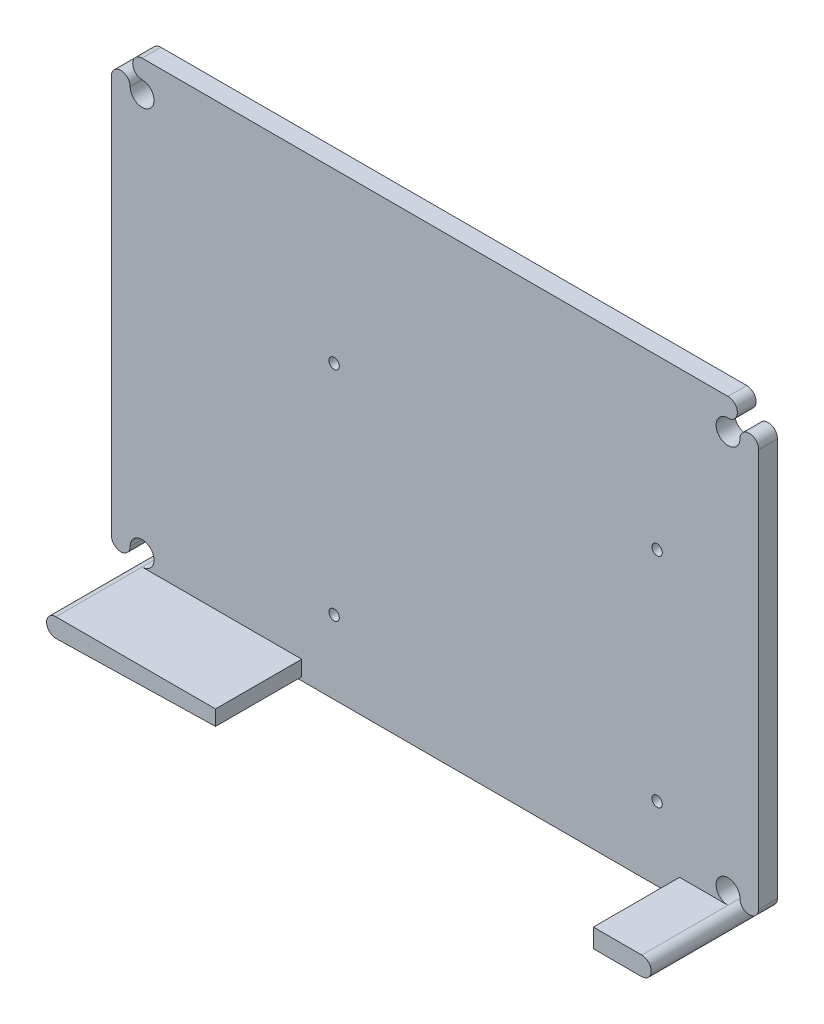
ISO-10303-21;
HEADER;
FILE_DESCRIPTION(('STEP AP214'),'2;1');
FILE_NAME('part.step','',(''),(''),'','','');
FILE_SCHEMA(('AUTOMOTIVE_DESIGN { 1 0 10303 214 1 1 1 1 }'));
ENDSEC;
DATA;
#1=APPLICATION_CONTEXT('core data for automotive mechanical design processes');
#2=APPLICATION_PROTOCOL_DEFINITION('international standard','automotive_design',2000,#1);
#3=PRODUCT_CONTEXT('',#1,'mechanical');
#4=PRODUCT('Part','Part','',(#3));
#5=PRODUCT_RELATED_PRODUCT_CATEGORY('part','',(#4));
#6=PRODUCT_DEFINITION_FORMATION('','',#4);
#7=PRODUCT_DEFINITION_CONTEXT('part definition',#1,'design');
#8=PRODUCT_DEFINITION('design','',#6,#7);
#9=PRODUCT_DEFINITION_SHAPE('','',#8);
#10=(LENGTH_UNIT() NAMED_UNIT(*) SI_UNIT(.MILLI.,.METRE.));
#11=(NAMED_UNIT(*) PLANE_ANGLE_UNIT() SI_UNIT($,.RADIAN.));
#12=(NAMED_UNIT(*) SI_UNIT($,.STERADIAN.) SOLID_ANGLE_UNIT());
#13=UNCERTAINTY_MEASURE_WITH_UNIT(LENGTH_MEASURE(1.E-05),#10,'distance_accuracy_value','');
#14=(GEOMETRIC_REPRESENTATION_CONTEXT(3) GLOBAL_UNCERTAINTY_ASSIGNED_CONTEXT((#13)) GLOBAL_UNIT_ASSIGNED_CONTEXT((#10,
#11,#12)) REPRESENTATION_CONTEXT('',''));
#15=CARTESIAN_POINT('',(0.,0.,0.));
#16=DIRECTION('',(0.,0.,1.));
#17=DIRECTION('',(1.,0.,0.));
#18=AXIS2_PLACEMENT_3D('',#15,#16,#17);
#19=CARTESIAN_POINT('',(77.993863436123,58.6749966821654,5.));
#20=DIRECTION('',(0.,0.,1.));
#21=DIRECTION('',(1.,0.,0.));
#22=AXIS2_PLACEMENT_3D('',#19,#20,#21);
#23=PLANE('',#22);
#24=CARTESIAN_POINT('',(59.1253494650505,16.3622236942246,5.));
#25=DIRECTION('',(0.,0.,1.));
#26=DIRECTION('',(1.,0.,0.));
#27=AXIS2_PLACEMENT_3D('',#24,#25,#26);
#28=CIRCLE('',#27,1.38);
#29=CARTESIAN_POINT('',(60.5053494650505,16.3622236942246,5.));
#30=VERTEX_POINT('',#29);
#31=EDGE_CURVE('E450',#30,#30,#28,.T.);
#32=ORIENTED_EDGE('',*,*,#31,.F.);
#33=EDGE_LOOP('',(#32));
#34=FACE_BOUND('',#33,.T.);
#35=CARTESIAN_POINT('',(-26.8746505349495,-41.6377763057754,5.));
#36=DIRECTION('',(0.,0.,1.));
#37=DIRECTION('',(1.,0.,0.));
#38=AXIS2_PLACEMENT_3D('',#35,#36,#37);
#39=CIRCLE('',#38,1.38);
#40=CARTESIAN_POINT('',(-25.4946505349495,-41.6377763057754,5.));
#41=VERTEX_POINT('',#40);
#42=EDGE_CURVE('E441',#41,#41,#39,.T.);
#43=ORIENTED_EDGE('',*,*,#42,.F.);
#44=EDGE_LOOP('',(#43));
#45=FACE_BOUND('',#44,.T.);
#46=CARTESIAN_POINT('',(-26.8746505349495,16.3622236942246,5.));
#47=DIRECTION('',(0.,0.,1.));
#48=DIRECTION('',(1.,0.,0.));
#49=AXIS2_PLACEMENT_3D('',#46,#47,#48);
#50=CIRCLE('',#49,1.38);
#51=CARTESIAN_POINT('',(-25.4946505349495,16.3622236942246,5.));
#52=VERTEX_POINT('',#51);
#53=EDGE_CURVE('E457',#52,#52,#50,.T.);
#54=ORIENTED_EDGE('',*,*,#53,.F.);
#55=EDGE_LOOP('',(#54));
#56=FACE_BOUND('',#55,.T.);
#57=CARTESIAN_POINT('',(59.1253494650505,-41.6377763057754,5.));
#58=DIRECTION('',(0.,0.,1.));
#59=DIRECTION('',(1.,0.,0.));
#60=AXIS2_PLACEMENT_3D('',#57,#58,#59);
#61=CIRCLE('',#60,1.38000000000001);
#62=CARTESIAN_POINT('',(60.5053494650505,-41.6377763057754,5.));
#63=VERTEX_POINT('',#62);
#64=EDGE_CURVE('E433',#63,#63,#61,.T.);
#65=ORIENTED_EDGE('',*,*,#64,.F.);
#66=EDGE_LOOP('',(#65));
#67=FACE_BOUND('',#66,.T.);
#68=DIRECTION('',(1.,0.,0.));
#69=VECTOR('',#68,1.);
#70=CARTESIAN_POINT('',(-77.9999999999997,-61.1750000000004,5.));
#71=LINE('',#70,#69);
#72=CARTESIAN_POINT('',(-77.9999999999997,-61.1750000000004,5.));
#73=VERTEX_POINT('',#72);
#74=CARTESIAN_POINT('',(65.0992655319275,-61.1750000000004,5.));
#75=VERTEX_POINT('',#74);
#76=EDGE_CURVE('E330',#73,#75,#71,.T.);
#77=ORIENTED_EDGE('',*,*,#76,.T.);
#78=DIRECTION('',(0.,-1.,0.));
#79=VECTOR('',#78,1.);
#80=CARTESIAN_POINT('',(65.0992655319275,-56.1750000000004,5.));
#81=LINE('',#80,#79);
#82=CARTESIAN_POINT('',(65.0992655319275,-56.1750000000004,5.));
#83=VERTEX_POINT('',#82);
#84=EDGE_CURVE('E414',#83,#75,#81,.T.);
#85=ORIENTED_EDGE('',*,*,#84,.F.);
#86=DIRECTION('',(-1.,0.,0.));
#87=VECTOR('',#86,1.);
#88=CARTESIAN_POINT('',(78.0000000000003,-56.1750000000004,5.));
#89=LINE('',#88,#87);
#90=CARTESIAN_POINT('',(78.0000000000003,-56.1750000000004,5.));
#91=VERTEX_POINT('',#90);
#92=EDGE_CURVE('E341',#91,#83,#89,.T.);
#93=ORIENTED_EDGE('',*,*,#92,.F.);
#94=CARTESIAN_POINT('',(78.0000000000003,-53.0000000000003,5.));
#95=DIRECTION('',(0.,0.,-1.));
#96=DIRECTION('',(1.,0.,0.));
#97=AXIS2_PLACEMENT_3D('',#94,#95,#96);
#98=CIRCLE('',#97,3.17500000000003);
#99=CARTESIAN_POINT('',(81.1750000000003,-53.0000000000004,5.));
#100=VERTEX_POINT('',#99);
#101=EDGE_CURVE('E333',#91,#100,#98,.T.);
#102=ORIENTED_EDGE('',*,*,#101,.T.);
#103=CARTESIAN_POINT('',(83.6750000000003,-53.0000000000005,5.));
#104=DIRECTION('',(0.,0.,1.));
#105=DIRECTION('',(-1.,0.,0.));
#106=AXIS2_PLACEMENT_3D('',#103,#104,#105);
#107=CIRCLE('',#106,2.49999999999975);
#108=CARTESIAN_POINT('',(86.175,-53.0000000000006,5.));
#109=VERTEX_POINT('',#108);
#110=EDGE_CURVE('E171',#100,#109,#107,.T.);
#111=ORIENTED_EDGE('',*,*,#110,.T.);
#112=DIRECTION('',(0.,1.,0.));
#113=VECTOR('',#112,1.);
#114=CARTESIAN_POINT('',(86.1749999999998,-53.0000000000006,5.));
#115=LINE('',#114,#113);
#116=CARTESIAN_POINT('',(86.1749999999997,53.0000000000004,5.));
#117=VERTEX_POINT('',#116);
#118=EDGE_CURVE('E164',#109,#117,#115,.T.);
#119=ORIENTED_EDGE('',*,*,#118,.T.);
#120=CARTESIAN_POINT('',(83.6749999999997,53.0000000000004,5.));
#121=DIRECTION('',(0.,0.,1.));
#122=DIRECTION('',(-1.,0.,0.));
#123=AXIS2_PLACEMENT_3D('',#120,#121,#122);
#124=CIRCLE('',#123,2.49999999999999);
#125=CARTESIAN_POINT('',(81.1749999999997,53.0000000000004,5.));
#126=VERTEX_POINT('',#125);
#127=EDGE_CURVE('E168',#117,#126,#124,.T.);
#128=ORIENTED_EDGE('',*,*,#127,.T.);
#129=CARTESIAN_POINT('',(77.9999999999997,53.0000000000004,5.));
#130=DIRECTION('',(0.,0.,-1.));
#131=DIRECTION('',(1.,0.,0.));
#132=AXIS2_PLACEMENT_3D('',#129,#130,#131);
#133=CIRCLE('',#132,3.17500000000001);
#134=CARTESIAN_POINT('',(77.9965667682273,56.1749981437667,5.));
#135=VERTEX_POINT('',#134);
#136=EDGE_CURVE('E63',#126,#135,#133,.T.);
#137=ORIENTED_EDGE('',*,*,#136,.T.);
#138=CARTESIAN_POINT('',(77.993863436123,58.6749966821654,5.));
#139=DIRECTION('',(0.,0.,1.));
#140=DIRECTION('',(1.,0.,0.));
#141=AXIS2_PLACEMENT_3D('',#138,#139,#140);
#142=CIRCLE('',#141,2.50000000000001);
#143=CARTESIAN_POINT('',(77.9911601040188,61.1749952205641,5.));
#144=VERTEX_POINT('',#143);
#145=EDGE_CURVE('E244',#135,#144,#142,.T.);
#146=ORIENTED_EDGE('',*,*,#145,.T.);
#147=DIRECTION('',(-1.,0.,0.));
#148=VECTOR('',#147,1.);
#149=CARTESIAN_POINT('',(-77.9999999999997,61.1749952205641,5.));
#150=LINE('',#149,#148);
#151=CARTESIAN_POINT('',(-77.9999999999997,61.1749952205641,5.));
#152=VERTEX_POINT('',#151);
#153=EDGE_CURVE('E128',#144,#152,#150,.T.);
#154=ORIENTED_EDGE('',*,*,#153,.T.);
#155=CARTESIAN_POINT('',(-77.9999999999997,58.6749952205641,5.));
#156=DIRECTION('',(0.,0.,1.));
#157=DIRECTION('',(-1.,0.,0.));
#158=AXIS2_PLACEMENT_3D('',#155,#156,#157);
#159=CIRCLE('',#158,2.49999999999999);
#160=CARTESIAN_POINT('',(-77.9999999999997,56.1749952205641,5.));
#161=VERTEX_POINT('',#160);
#162=EDGE_CURVE('E297',#152,#161,#159,.T.);
#163=ORIENTED_EDGE('',*,*,#162,.T.);
#164=CARTESIAN_POINT('',(-77.9999999999997,52.9999952205641,5.));
#165=DIRECTION('',(0.,0.,-1.));
#166=DIRECTION('',(1.,0.,0.));
#167=AXIS2_PLACEMENT_3D('',#164,#165,#166);
#168=CIRCLE('',#167,3.17500000000001);
#169=CARTESIAN_POINT('',(-81.1749999999997,52.9999952205641,5.));
#170=VERTEX_POINT('',#169);
#171=EDGE_CURVE('E316',#161,#170,#168,.T.);
#172=ORIENTED_EDGE('',*,*,#171,.T.);
#173=CARTESIAN_POINT('',(-83.6749999999997,52.9999952205641,5.));
#174=DIRECTION('',(0.,0.,1.));
#175=DIRECTION('',(-1.,0.,0.));
#176=AXIS2_PLACEMENT_3D('',#173,#174,#175);
#177=CIRCLE('',#176,2.49999999999999);
#178=CARTESIAN_POINT('',(-86.1749999999997,52.9999952205641,5.));
#179=VERTEX_POINT('',#178);
#180=EDGE_CURVE('E312',#170,#179,#177,.T.);
#181=ORIENTED_EDGE('',*,*,#180,.T.);
#182=DIRECTION('',(0.,-1.,0.));
#183=VECTOR('',#182,1.);
#184=CARTESIAN_POINT('',(-86.1749999999997,-53.0000000000004,5.));
#185=LINE('',#184,#183);
#186=CARTESIAN_POINT('',(-86.1749999999997,-53.0000000000004,5.));
#187=VERTEX_POINT('',#186);
#188=EDGE_CURVE('E315',#179,#187,#185,.T.);
#189=ORIENTED_EDGE('',*,*,#188,.T.);
#190=CARTESIAN_POINT('',(-83.6749999999997,-53.0000000000004,5.));
#191=DIRECTION('',(0.,0.,1.));
#192=DIRECTION('',(-1.,0.,0.));
#193=AXIS2_PLACEMENT_3D('',#190,#191,#192);
#194=CIRCLE('',#193,2.50000000000002);
#195=CARTESIAN_POINT('',(-81.1749999999997,-53.0000000000004,5.));
#196=VERTEX_POINT('',#195);
#197=EDGE_CURVE('E320',#187,#196,#194,.T.);
#198=ORIENTED_EDGE('',*,*,#197,.T.);
#199=CARTESIAN_POINT('',(-77.9999999999997,-53.0000000000004,5.));
#200=DIRECTION('',(0.,0.,-1.));
#201=DIRECTION('',(1.,0.,0.));
#202=AXIS2_PLACEMENT_3D('',#199,#200,#201);
#203=CIRCLE('',#202,3.175);
#204=CARTESIAN_POINT('',(-77.9999999999997,-56.1750000000004,5.));
#205=VERTEX_POINT('',#204);
#206=EDGE_CURVE('E327',#196,#205,#203,.T.);
#207=ORIENTED_EDGE('',*,*,#206,.T.);
#208=DIRECTION('',(-1.,0.,0.));
#209=VECTOR('',#208,1.);
#210=CARTESIAN_POINT('',(-77.9999999999997,-56.1750000000004,5.));
#211=LINE('',#210,#209);
#212=CARTESIAN_POINT('',(-35.4999999999997,-56.1750000000004,5.));
#213=VERTEX_POINT('',#212);
#214=EDGE_CURVE('E55',#213,#205,#211,.T.);
#215=ORIENTED_EDGE('',*,*,#214,.F.);
#216=DIRECTION('',(0.,1.,0.));
#217=VECTOR('',#216,1.);
#218=CARTESIAN_POINT('',(-35.4999999999997,-56.1750000000004,5.));
#219=LINE('',#218,#217);
#220=CARTESIAN_POINT('',(-35.4999999999997,-60.2122236942248,5.));
#221=VERTEX_POINT('',#220);
#222=EDGE_CURVE('E378',#221,#213,#219,.T.);
#223=ORIENTED_EDGE('',*,*,#222,.F.);
#224=DIRECTION('',(0.999743506823469,0.0226477496522961,0.));
#225=VECTOR('',#224,1.);
#226=CARTESIAN_POINT('',(-35.4999999999997,-60.2122236942248,5.));
#227=LINE('',#226,#225);
#228=EDGE_CURVE('E381',#73,#221,#227,.T.);
#229=ORIENTED_EDGE('',*,*,#228,.F.);
#230=EDGE_LOOP('',(#77,#85,#93,#102,#111,#119,#128,#137,#146,#154,#163,#172,#181,#189,#198,#207,
#215,#223,#229));
#231=FACE_BOUND('',#230,.T.);
#232=ADVANCED_FACE('F39',(#34,#45,#56,#67,#231),#23,.T.);
#233=CARTESIAN_POINT('',(77.993863436123,58.6749966821654,5.));
#234=DIRECTION('',(0.,0.,-1.));
#235=DIRECTION('',(-1.,0.,0.));
#236=AXIS2_PLACEMENT_3D('',#233,#234,#235);
#237=CYLINDRICAL_SURFACE('',#236,2.50000000000001);
#238=CARTESIAN_POINT('',(77.993863436123,58.6749966821654,0.));
#239=DIRECTION('',(0.,0.,1.));
#240=DIRECTION('',(1.,0.,0.));
#241=AXIS2_PLACEMENT_3D('',#238,#239,#240);
#242=CIRCLE('',#241,2.50000000000001);
#243=CARTESIAN_POINT('',(77.9965667682273,56.1749981437667,0.));
#244=VERTEX_POINT('',#243);
#245=CARTESIAN_POINT('',(77.9911601040188,61.1749952205641,0.));
#246=VERTEX_POINT('',#245);
#247=EDGE_CURVE('E196',#244,#246,#242,.T.);
#248=ORIENTED_EDGE('',*,*,#247,.T.);
#249=DIRECTION('',(0.,0.,-1.));
#250=VECTOR('',#249,1.);
#251=CARTESIAN_POINT('',(77.9911601040188,61.1749952205641,5.));
#252=LINE('',#251,#250);
#253=EDGE_CURVE('E11',#144,#246,#252,.T.);
#254=ORIENTED_EDGE('',*,*,#253,.F.);
#255=ORIENTED_EDGE('',*,*,#145,.F.);
#256=DIRECTION('',(0.,0.,-1.));
#257=VECTOR('',#256,1.);
#258=CARTESIAN_POINT('',(77.9965667682273,56.1749981437667,5.));
#259=LINE('',#258,#257);
#260=EDGE_CURVE('E192',#135,#244,#259,.T.);
#261=ORIENTED_EDGE('',*,*,#260,.T.);
#262=EDGE_LOOP('',(#248,#254,#255,#261));
#263=FACE_BOUND('',#262,.T.);
#264=ADVANCED_FACE('F41',(#263),#237,.T.);
#265=CARTESIAN_POINT('',(-77.9999999999997,61.1749952205641,5.));
#266=DIRECTION('',(0.,-1.,0.));
#267=DIRECTION('',(0.,0.,-1.));
#268=AXIS2_PLACEMENT_3D('',#265,#266,#267);
#269=PLANE('',#268);
#270=DIRECTION('',(-1.,0.,0.));
#271=VECTOR('',#270,1.);
#272=CARTESIAN_POINT('',(-77.9999999999997,61.1749952205641,0.));
#273=LINE('',#272,#271);
#274=CARTESIAN_POINT('',(-77.9999999999997,61.1749952205641,0.));
#275=VERTEX_POINT('',#274);
#276=EDGE_CURVE('E200',#246,#275,#273,.T.);
#277=ORIENTED_EDGE('',*,*,#276,.T.);
#278=DIRECTION('',(0.,0.,-1.));
#279=VECTOR('',#278,1.);
#280=CARTESIAN_POINT('',(-77.9999999999997,61.1749952205641,5.));
#281=LINE('',#280,#279);
#282=EDGE_CURVE('E48',#152,#275,#281,.T.);
#283=ORIENTED_EDGE('',*,*,#282,.F.);
#284=ORIENTED_EDGE('',*,*,#153,.F.);
#285=ORIENTED_EDGE('',*,*,#253,.T.);
#286=EDGE_LOOP('',(#277,#283,#284,#285));
#287=FACE_BOUND('',#286,.T.);
#288=ADVANCED_FACE('F560',(#287),#269,.F.);
#289=CARTESIAN_POINT('',(-77.9999999999997,58.6749952205641,5.));
#290=DIRECTION('',(0.,0.,-1.));
#291=DIRECTION('',(-1.,0.,0.));
#292=AXIS2_PLACEMENT_3D('',#289,#290,#291);
#293=CYLINDRICAL_SURFACE('',#292,2.49999999999999);
#294=CARTESIAN_POINT('',(-77.9999999999997,58.6749952205641,0.));
#295=DIRECTION('',(0.,0.,1.));
#296=DIRECTION('',(-1.,0.,0.));
#297=AXIS2_PLACEMENT_3D('',#294,#295,#296);
#298=CIRCLE('',#297,2.49999999999999);
#299=CARTESIAN_POINT('',(-77.9999999999997,56.1749952205641,0.));
#300=VERTEX_POINT('',#299);
#301=EDGE_CURVE('E204',#275,#300,#298,.T.);
#302=ORIENTED_EDGE('',*,*,#301,.T.);
#303=DIRECTION('',(0.,0.,-1.));
#304=VECTOR('',#303,1.);
#305=CARTESIAN_POINT('',(-77.9999999999997,56.1749952205641,5.));
#306=LINE('',#305,#304);
#307=EDGE_CURVE('E287',#161,#300,#306,.T.);
#308=ORIENTED_EDGE('',*,*,#307,.F.);
#309=ORIENTED_EDGE('',*,*,#162,.F.);
#310=ORIENTED_EDGE('',*,*,#282,.T.);
#311=EDGE_LOOP('',(#302,#308,#309,#310));
#312=FACE_BOUND('',#311,.T.);
#313=ADVANCED_FACE('F295',(#312),#293,.T.);
#314=CARTESIAN_POINT('',(-77.9999999999997,52.9999952205641,5.));
#315=DIRECTION('',(0.,0.,-1.));
#316=DIRECTION('',(-1.,0.,0.));
#317=AXIS2_PLACEMENT_3D('',#314,#315,#316);
#318=CYLINDRICAL_SURFACE('',#317,3.17500000000001);
#319=CARTESIAN_POINT('',(-77.9999999999997,52.9999952205641,0.));
#320=DIRECTION('',(0.,0.,-1.));
#321=DIRECTION('',(1.,0.,0.));
#322=AXIS2_PLACEMENT_3D('',#319,#320,#321);
#323=CIRCLE('',#322,3.17500000000001);
#324=CARTESIAN_POINT('',(-81.1749999999997,52.9999952205641,0.));
#325=VERTEX_POINT('',#324);
#326=EDGE_CURVE('E207',#300,#325,#323,.T.);
#327=ORIENTED_EDGE('',*,*,#326,.T.);
#328=DIRECTION('',(0.,0.,-1.));
#329=VECTOR('',#328,1.);
#330=CARTESIAN_POINT('',(-81.1749999999997,52.9999952205641,5.));
#331=LINE('',#330,#329);
#332=EDGE_CURVE('E283',#170,#325,#331,.T.);
#333=ORIENTED_EDGE('',*,*,#332,.F.);
#334=ORIENTED_EDGE('',*,*,#171,.F.);
#335=ORIENTED_EDGE('',*,*,#307,.T.);
#336=EDGE_LOOP('',(#327,#333,#334,#335));
#337=FACE_BOUND('',#336,.T.);
#338=ADVANCED_FACE('F306',(#337),#318,.F.);
#339=CARTESIAN_POINT('',(-83.6749999999997,52.9999952205641,5.));
#340=DIRECTION('',(0.,0.,-1.));
#341=DIRECTION('',(-1.,0.,0.));
#342=AXIS2_PLACEMENT_3D('',#339,#340,#341);
#343=CYLINDRICAL_SURFACE('',#342,2.49999999999999);
#344=CARTESIAN_POINT('',(-83.6749999999997,52.9999952205641,0.));
#345=DIRECTION('',(0.,0.,1.));
#346=DIRECTION('',(-1.,0.,0.));
#347=AXIS2_PLACEMENT_3D('',#344,#345,#346);
#348=CIRCLE('',#347,2.49999999999999);
#349=CARTESIAN_POINT('',(-86.1749999999997,52.9999952205641,0.));
#350=VERTEX_POINT('',#349);
#351=EDGE_CURVE('E210',#325,#350,#348,.T.);
#352=ORIENTED_EDGE('',*,*,#351,.T.);
#353=DIRECTION('',(0.,0.,-1.));
#354=VECTOR('',#353,1.);
#355=CARTESIAN_POINT('',(-86.1749999999997,52.9999952205641,5.));
#356=LINE('',#355,#354);
#357=EDGE_CURVE('E279',#179,#350,#356,.T.);
#358=ORIENTED_EDGE('',*,*,#357,.F.);
#359=ORIENTED_EDGE('',*,*,#180,.F.);
#360=ORIENTED_EDGE('',*,*,#332,.T.);
#361=EDGE_LOOP('',(#352,#358,#359,#360));
#362=FACE_BOUND('',#361,.T.);
#363=ADVANCED_FACE('F310',(#362),#343,.T.);
#364=CARTESIAN_POINT('',(-86.1749999999997,-53.0000000000004,5.));
#365=DIRECTION('',(1.,0.,0.));
#366=DIRECTION('',(0.,1.,0.));
#367=AXIS2_PLACEMENT_3D('',#364,#365,#366);
#368=PLANE('',#367);
#369=DIRECTION('',(0.,-1.,0.));
#370=VECTOR('',#369,1.);
#371=CARTESIAN_POINT('',(-86.1749999999997,-53.0000000000004,0.));
#372=LINE('',#371,#370);
#373=CARTESIAN_POINT('',(-86.1749999999997,-53.0000000000004,0.));
#374=VERTEX_POINT('',#373);
#375=EDGE_CURVE('E213',#350,#374,#372,.T.);
#376=ORIENTED_EDGE('',*,*,#375,.T.);
#377=DIRECTION('',(0.,0.,-1.));
#378=VECTOR('',#377,1.);
#379=CARTESIAN_POINT('',(-86.1749999999997,-53.0000000000004,5.));
#380=LINE('',#379,#378);
#381=EDGE_CURVE('E275',#187,#374,#380,.T.);
#382=ORIENTED_EDGE('',*,*,#381,.F.);
#383=ORIENTED_EDGE('',*,*,#188,.F.);
#384=ORIENTED_EDGE('',*,*,#357,.T.);
#385=EDGE_LOOP('',(#376,#382,#383,#384));
#386=FACE_BOUND('',#385,.T.);
#387=ADVANCED_FACE('F550',(#386),#368,.F.);
#388=CARTESIAN_POINT('',(-83.6749999999997,-53.0000000000004,5.));
#389=DIRECTION('',(0.,0.,-1.));
#390=DIRECTION('',(-1.,0.,0.));
#391=AXIS2_PLACEMENT_3D('',#388,#389,#390);
#392=CYLINDRICAL_SURFACE('',#391,2.50000000000002);
#393=CARTESIAN_POINT('',(-83.6749999999997,-53.0000000000004,0.));
#394=DIRECTION('',(0.,0.,1.));
#395=DIRECTION('',(-1.,0.,0.));
#396=AXIS2_PLACEMENT_3D('',#393,#394,#395);
#397=CIRCLE('',#396,2.50000000000002);
#398=CARTESIAN_POINT('',(-81.1749999999997,-53.0000000000004,0.));
#399=VERTEX_POINT('',#398);
#400=EDGE_CURVE('E216',#374,#399,#397,.T.);
#401=ORIENTED_EDGE('',*,*,#400,.T.);
#402=DIRECTION('',(0.,0.,-1.));
#403=VECTOR('',#402,1.);
#404=CARTESIAN_POINT('',(-81.1749999999997,-53.0000000000004,5.));
#405=LINE('',#404,#403);
#406=EDGE_CURVE('E271',#196,#399,#405,.T.);
#407=ORIENTED_EDGE('',*,*,#406,.F.);
#408=ORIENTED_EDGE('',*,*,#197,.F.);
#409=ORIENTED_EDGE('',*,*,#381,.T.);
#410=EDGE_LOOP('',(#401,#407,#408,#409));
#411=FACE_BOUND('',#410,.T.);
#412=ADVANCED_FACE('F546',(#411),#392,.T.);
#413=CARTESIAN_POINT('',(-77.9999999999997,-53.0000000000004,5.));
#414=DIRECTION('',(0.,0.,-1.));
#415=DIRECTION('',(-1.,0.,0.));
#416=AXIS2_PLACEMENT_3D('',#413,#414,#415);
#417=CYLINDRICAL_SURFACE('',#416,3.175);
#418=CARTESIAN_POINT('',(-77.9999999999997,-53.0000000000004,0.));
#419=DIRECTION('',(0.,0.,-1.));
#420=DIRECTION('',(1.,0.,0.));
#421=AXIS2_PLACEMENT_3D('',#418,#419,#420);
#422=CIRCLE('',#421,3.175);
#423=CARTESIAN_POINT('',(-77.9999999999997,-56.1750000000004,0.));
#424=VERTEX_POINT('',#423);
#425=EDGE_CURVE('E219',#399,#424,#422,.T.);
#426=ORIENTED_EDGE('',*,*,#425,.T.);
#427=DIRECTION('',(0.,0.,-1.));
#428=VECTOR('',#427,1.);
#429=CARTESIAN_POINT('',(-77.9999999999997,-56.1750000000004,5.));
#430=LINE('',#429,#428);
#431=EDGE_CURVE('E267',#205,#424,#430,.T.);
#432=ORIENTED_EDGE('',*,*,#431,.F.);
#433=ORIENTED_EDGE('',*,*,#206,.F.);
#434=ORIENTED_EDGE('',*,*,#406,.T.);
#435=EDGE_LOOP('',(#426,#432,#433,#434));
#436=FACE_BOUND('',#435,.T.);
#437=ADVANCED_FACE('F542',(#436),#417,.F.);
#438=CARTESIAN_POINT('',(-77.9999999999997,-58.6750000000004,5.));
#439=DIRECTION('',(0.,0.,-1.));
#440=DIRECTION('',(-1.,0.,0.));
#441=AXIS2_PLACEMENT_3D('',#438,#439,#440);
#442=CYLINDRICAL_SURFACE('',#441,2.49999999999999);
#443=CARTESIAN_POINT('',(-77.9999999999997,-58.6750000000004,0.));
#444=DIRECTION('',(0.,0.,1.));
#445=DIRECTION('',(1.,0.,0.));
#446=AXIS2_PLACEMENT_3D('',#443,#444,#445);
#447=CIRCLE('',#446,2.49999999999999);
#448=CARTESIAN_POINT('',(-77.9999999999997,-61.1750000000004,0.));
#449=VERTEX_POINT('',#448);
#450=EDGE_CURVE('E222',#424,#449,#447,.T.);
#451=ORIENTED_EDGE('',*,*,#450,.T.);
#452=DIRECTION('',(0.,0.,-1.));
#453=VECTOR('',#452,1.);
#454=CARTESIAN_POINT('',(-77.9999999999997,-61.1750000000004,5.));
#455=LINE('',#454,#453);
#456=EDGE_CURVE('E263',#73,#449,#455,.T.);
#457=ORIENTED_EDGE('',*,*,#456,.F.);
#458=DIRECTION('',(0.,0.,-1.));
#459=VECTOR('',#458,1.);
#460=CARTESIAN_POINT('',(-77.9999999999997,-61.1750000000004,27.95));
#461=LINE('',#460,#459);
#462=CARTESIAN_POINT('',(-77.9999999999997,-61.1750000000004,27.95));
#463=VERTEX_POINT('',#462);
#464=EDGE_CURVE('E201',#463,#73,#461,.T.);
#465=ORIENTED_EDGE('',*,*,#464,.F.);
#466=CARTESIAN_POINT('',(-77.9999999999997,-58.6750000000004,27.95));
#467=DIRECTION('',(0.,0.,1.));
#468=DIRECTION('',(1.,0.,0.));
#469=AXIS2_PLACEMENT_3D('',#466,#467,#468);
#470=CIRCLE('',#469,2.49999999999999);
#471=CARTESIAN_POINT('',(-77.9999999999997,-56.1750000000004,27.95));
#472=VERTEX_POINT('',#471);
#473=EDGE_CURVE('E377',#472,#463,#470,.T.);
#474=ORIENTED_EDGE('',*,*,#473,.F.);
#475=DIRECTION('',(0.,0.,-1.));
#476=VECTOR('',#475,1.);
#477=CARTESIAN_POINT('',(-77.9999999999997,-56.1750000000004,27.95));
#478=LINE('',#477,#476);
#479=EDGE_CURVE('E370',#472,#205,#478,.T.);
#480=ORIENTED_EDGE('',*,*,#479,.T.);
#481=ORIENTED_EDGE('',*,*,#431,.T.);
#482=EDGE_LOOP('',(#451,#457,#465,#474,#480,#481));
#483=FACE_BOUND('',#482,.T.);
#484=ADVANCED_FACE('F538',(#483),#442,.T.);
#485=CARTESIAN_POINT('',(-77.9999999999997,-61.1750000000004,5.));
#486=DIRECTION('',(0.,1.,0.));
#487=DIRECTION('',(0.,0.,1.));
#488=AXIS2_PLACEMENT_3D('',#485,#486,#487);
#489=PLANE('',#488);
#490=DIRECTION('',(1.,0.,0.));
#491=VECTOR('',#490,1.);
#492=CARTESIAN_POINT('',(-77.9999999999997,-61.1750000000004,0.));
#493=LINE('',#492,#491);
#494=CARTESIAN_POINT('',(78.0000000000003,-61.1750000000004,0.));
#495=VERTEX_POINT('',#494);
#496=EDGE_CURVE('E225',#449,#495,#493,.T.);
#497=ORIENTED_EDGE('',*,*,#496,.T.);
#498=DIRECTION('',(0.,0.,-1.));
#499=VECTOR('',#498,1.);
#500=CARTESIAN_POINT('',(78.0000000000003,-61.1750000000004,5.));
#501=LINE('',#500,#499);
#502=CARTESIAN_POINT('',(78.0000000000003,-61.1750000000004,27.95));
#503=VERTEX_POINT('',#502);
#504=EDGE_CURVE('E259',#503,#495,#501,.T.);
#505=ORIENTED_EDGE('',*,*,#504,.F.);
#506=DIRECTION('',(1.,0.,0.));
#507=VECTOR('',#506,1.);
#508=CARTESIAN_POINT('',(78.0000000000003,-61.1750000000004,27.95));
#509=LINE('',#508,#507);
#510=CARTESIAN_POINT('',(65.0992655319275,-61.1750000000004,27.95));
#511=VERTEX_POINT('',#510);
#512=EDGE_CURVE('E426',#511,#503,#509,.T.);
#513=ORIENTED_EDGE('',*,*,#512,.F.);
#514=DIRECTION('',(0.,0.,-1.));
#515=VECTOR('',#514,1.);
#516=CARTESIAN_POINT('',(65.0992655319275,-61.1750000000004,27.95));
#517=LINE('',#516,#515);
#518=EDGE_CURVE('E385',#511,#75,#517,.T.);
#519=ORIENTED_EDGE('',*,*,#518,.T.);
#520=ORIENTED_EDGE('',*,*,#76,.F.);
#521=ORIENTED_EDGE('',*,*,#456,.T.);
#522=EDGE_LOOP('',(#497,#505,#513,#519,#520,#521));
#523=FACE_BOUND('',#522,.T.);
#524=ADVANCED_FACE('F534',(#523),#489,.F.);
#525=CARTESIAN_POINT('',(78.0000000000003,-58.6750000000004,5.));
#526=DIRECTION('',(0.,0.,-1.));
#527=DIRECTION('',(-1.,0.,0.));
#528=AXIS2_PLACEMENT_3D('',#525,#526,#527);
#529=CYLINDRICAL_SURFACE('',#528,2.49999999999998);
#530=CARTESIAN_POINT('',(78.0000000000003,-58.6750000000004,0.));
#531=DIRECTION('',(0.,0.,1.));
#532=DIRECTION('',(-1.,0.,0.));
#533=AXIS2_PLACEMENT_3D('',#530,#531,#532);
#534=CIRCLE('',#533,2.49999999999998);
#535=CARTESIAN_POINT('',(78.0000000000003,-56.1750000000004,0.));
#536=VERTEX_POINT('',#535);
#537=EDGE_CURVE('E228',#495,#536,#534,.T.);
#538=ORIENTED_EDGE('',*,*,#537,.T.);
#539=DIRECTION('',(0.,0.,-1.));
#540=VECTOR('',#539,1.);
#541=CARTESIAN_POINT('',(78.0000000000003,-56.1750000000004,5.));
#542=LINE('',#541,#540);
#543=EDGE_CURVE('E255',#91,#536,#542,.T.);
#544=ORIENTED_EDGE('',*,*,#543,.F.);
#545=DIRECTION('',(0.,0.,-1.));
#546=VECTOR('',#545,1.);
#547=CARTESIAN_POINT('',(78.0000000000003,-56.1750000000004,27.95));
#548=LINE('',#547,#546);
#549=CARTESIAN_POINT('',(78.0000000000003,-56.1750000000004,27.95));
#550=VERTEX_POINT('',#549);
#551=EDGE_CURVE('E403',#550,#91,#548,.T.);
#552=ORIENTED_EDGE('',*,*,#551,.F.);
#553=CARTESIAN_POINT('',(78.0000000000003,-58.6750000000004,27.95));
#554=DIRECTION('',(0.,0.,1.));
#555=DIRECTION('',(-1.,0.,0.));
#556=AXIS2_PLACEMENT_3D('',#553,#554,#555);
#557=CIRCLE('',#556,2.49999999999999);
#558=EDGE_CURVE('E422',#503,#550,#557,.T.);
#559=ORIENTED_EDGE('',*,*,#558,.F.);
#560=ORIENTED_EDGE('',*,*,#504,.T.);
#561=EDGE_LOOP('',(#538,#544,#552,#559,#560));
#562=FACE_BOUND('',#561,.T.);
#563=ADVANCED_FACE('F531',(#562),#529,.T.);
#564=CARTESIAN_POINT('',(78.0000000000003,-53.0000000000003,5.));
#565=DIRECTION('',(0.,0.,-1.));
#566=DIRECTION('',(-1.,0.,0.));
#567=AXIS2_PLACEMENT_3D('',#564,#565,#566);
#568=CYLINDRICAL_SURFACE('',#567,3.17500000000003);
#569=CARTESIAN_POINT('',(78.0000000000003,-53.0000000000003,0.));
#570=DIRECTION('',(0.,0.,-1.));
#571=DIRECTION('',(1.,0.,0.));
#572=AXIS2_PLACEMENT_3D('',#569,#570,#571);
#573=CIRCLE('',#572,3.17500000000003);
#574=CARTESIAN_POINT('',(81.1750000000003,-53.0000000000004,0.));
#575=VERTEX_POINT('',#574);
#576=EDGE_CURVE('E231',#536,#575,#573,.T.);
#577=ORIENTED_EDGE('',*,*,#576,.T.);
#578=DIRECTION('',(0.,0.,-1.));
#579=VECTOR('',#578,1.);
#580=CARTESIAN_POINT('',(81.1750000000003,-53.0000000000004,5.));
#581=LINE('',#580,#579);
#582=EDGE_CURVE('E251',#100,#575,#581,.T.);
#583=ORIENTED_EDGE('',*,*,#582,.F.);
#584=ORIENTED_EDGE('',*,*,#101,.F.);
#585=ORIENTED_EDGE('',*,*,#543,.T.);
#586=EDGE_LOOP('',(#577,#583,#584,#585));
#587=FACE_BOUND('',#586,.T.);
#588=ADVANCED_FACE('F344',(#587),#568,.F.);
#589=CARTESIAN_POINT('',(83.6750000000003,-53.0000000000005,5.));
#590=DIRECTION('',(0.,0.,-1.));
#591=DIRECTION('',(-1.,0.,0.));
#592=AXIS2_PLACEMENT_3D('',#589,#590,#591);
#593=CYLINDRICAL_SURFACE('',#592,2.49999999999975);
#594=CARTESIAN_POINT('',(83.6750000000003,-53.0000000000005,0.));
#595=DIRECTION('',(0.,0.,1.));
#596=DIRECTION('',(-1.,0.,0.));
#597=AXIS2_PLACEMENT_3D('',#594,#595,#596);
#598=CIRCLE('',#597,2.49999999999975);
#599=CARTESIAN_POINT('',(86.175,-53.0000000000006,0.));
#600=VERTEX_POINT('',#599);
#601=EDGE_CURVE('E234',#575,#600,#598,.T.);
#602=ORIENTED_EDGE('',*,*,#601,.T.);
#603=DIRECTION('',(0.,0.,-1.));
#604=VECTOR('',#603,1.);
#605=CARTESIAN_POINT('',(86.175,-53.0000000000006,5.));
#606=LINE('',#605,#604);
#607=EDGE_CURVE('E185',#109,#600,#606,.T.);
#608=ORIENTED_EDGE('',*,*,#607,.F.);
#609=ORIENTED_EDGE('',*,*,#110,.F.);
#610=ORIENTED_EDGE('',*,*,#582,.T.);
#611=EDGE_LOOP('',(#602,#608,#609,#610));
#612=FACE_BOUND('',#611,.T.);
#613=ADVANCED_FACE('F348',(#612),#593,.T.);
#614=CARTESIAN_POINT('',(86.1749999999998,-53.0000000000006,5.));
#615=DIRECTION('',(-1.,0.,0.));
#616=DIRECTION('',(0.,-1.,0.));
#617=AXIS2_PLACEMENT_3D('',#614,#615,#616);
#618=PLANE('',#617);
#619=DIRECTION('',(0.,1.,0.));
#620=VECTOR('',#619,1.);
#621=CARTESIAN_POINT('',(86.1749999999998,-53.0000000000006,0.));
#622=LINE('',#621,#620);
#623=CARTESIAN_POINT('',(86.1749999999997,53.0000000000004,0.));
#624=VERTEX_POINT('',#623);
#625=EDGE_CURVE('E181',#600,#624,#622,.T.);
#626=ORIENTED_EDGE('',*,*,#625,.T.);
#627=DIRECTION('',(0.,0.,-1.));
#628=VECTOR('',#627,1.);
#629=CARTESIAN_POINT('',(86.1749999999997,53.0000000000004,5.));
#630=LINE('',#629,#628);
#631=EDGE_CURVE('E178',#117,#624,#630,.T.);
#632=ORIENTED_EDGE('',*,*,#631,.F.);
#633=ORIENTED_EDGE('',*,*,#118,.F.);
#634=ORIENTED_EDGE('',*,*,#607,.T.);
#635=EDGE_LOOP('',(#626,#632,#633,#634));
#636=FACE_BOUND('',#635,.T.);
#637=ADVANCED_FACE('F179',(#636),#618,.F.);
#638=CARTESIAN_POINT('',(83.6749999999997,53.0000000000004,5.));
#639=DIRECTION('',(0.,0.,-1.));
#640=DIRECTION('',(-1.,0.,0.));
#641=AXIS2_PLACEMENT_3D('',#638,#639,#640);
#642=CYLINDRICAL_SURFACE('',#641,2.49999999999999);
#643=CARTESIAN_POINT('',(83.6749999999997,53.0000000000004,0.));
#644=DIRECTION('',(0.,0.,1.));
#645=DIRECTION('',(-1.,0.,0.));
#646=AXIS2_PLACEMENT_3D('',#643,#644,#645);
#647=CIRCLE('',#646,2.49999999999999);
#648=CARTESIAN_POINT('',(81.1749999999997,53.0000000000004,0.));
#649=VERTEX_POINT('',#648);
#650=EDGE_CURVE('E239',#624,#649,#647,.T.);
#651=ORIENTED_EDGE('',*,*,#650,.T.);
#652=DIRECTION('',(0.,0.,-1.));
#653=VECTOR('',#652,1.);
#654=CARTESIAN_POINT('',(81.1749999999997,53.0000000000004,5.));
#655=LINE('',#654,#653);
#656=EDGE_CURVE('E186',#126,#649,#655,.T.);
#657=ORIENTED_EDGE('',*,*,#656,.F.);
#658=ORIENTED_EDGE('',*,*,#127,.F.);
#659=ORIENTED_EDGE('',*,*,#631,.T.);
#660=EDGE_LOOP('',(#651,#657,#658,#659));
#661=FACE_BOUND('',#660,.T.);
#662=ADVANCED_FACE('F188',(#661),#642,.T.);
#663=CARTESIAN_POINT('',(77.9999999999997,53.0000000000004,5.));
#664=DIRECTION('',(0.,0.,-1.));
#665=DIRECTION('',(-1.,0.,0.));
#666=AXIS2_PLACEMENT_3D('',#663,#664,#665);
#667=CYLINDRICAL_SURFACE('',#666,3.17500000000001);
#668=CARTESIAN_POINT('',(77.9999999999997,53.0000000000004,0.));
#669=DIRECTION('',(0.,0.,-1.));
#670=DIRECTION('',(1.,0.,0.));
#671=AXIS2_PLACEMENT_3D('',#668,#669,#670);
#672=CIRCLE('',#671,3.17500000000001);
#673=EDGE_CURVE('E120',#649,#244,#672,.T.);
#674=ORIENTED_EDGE('',*,*,#673,.T.);
#675=ORIENTED_EDGE('',*,*,#260,.F.);
#676=ORIENTED_EDGE('',*,*,#136,.F.);
#677=ORIENTED_EDGE('',*,*,#656,.T.);
#678=EDGE_LOOP('',(#674,#675,#676,#677));
#679=FACE_BOUND('',#678,.T.);
#680=ADVANCED_FACE('F349',(#679),#667,.F.);
#681=CARTESIAN_POINT('',(77.993863436123,58.6749966821654,0.));
#682=DIRECTION('',(0.,0.,1.));
#683=DIRECTION('',(1.,0.,0.));
#684=AXIS2_PLACEMENT_3D('',#681,#682,#683);
#685=PLANE('',#684);
#686=CARTESIAN_POINT('',(59.1253494650505,16.3622236942246,0.));
#687=DIRECTION('',(0.,0.,1.));
#688=DIRECTION('',(1.,0.,0.));
#689=AXIS2_PLACEMENT_3D('',#686,#687,#688);
#690=CIRCLE('',#689,1.38);
#691=CARTESIAN_POINT('',(60.5053494650505,16.3622236942246,0.));
#692=VERTEX_POINT('',#691);
#693=EDGE_CURVE('E437',#692,#692,#690,.T.);
#694=ORIENTED_EDGE('',*,*,#693,.T.);
#695=EDGE_LOOP('',(#694));
#696=FACE_BOUND('',#695,.T.);
#697=CARTESIAN_POINT('',(-26.8746505349495,-41.6377763057754,0.));
#698=DIRECTION('',(0.,0.,1.));
#699=DIRECTION('',(1.,0.,0.));
#700=AXIS2_PLACEMENT_3D('',#697,#698,#699);
#701=CIRCLE('',#700,1.38);
#702=CARTESIAN_POINT('',(-25.4946505349495,-41.6377763057754,0.));
#703=VERTEX_POINT('',#702);
#704=EDGE_CURVE('E445',#703,#703,#701,.T.);
#705=ORIENTED_EDGE('',*,*,#704,.T.);
#706=EDGE_LOOP('',(#705));
#707=FACE_BOUND('',#706,.T.);
#708=CARTESIAN_POINT('',(-26.8746505349495,16.3622236942246,0.));
#709=DIRECTION('',(0.,0.,1.));
#710=DIRECTION('',(1.,0.,0.));
#711=AXIS2_PLACEMENT_3D('',#708,#709,#710);
#712=CIRCLE('',#711,1.38);
#713=CARTESIAN_POINT('',(-25.4946505349495,16.3622236942246,0.));
#714=VERTEX_POINT('',#713);
#715=EDGE_CURVE('E446',#714,#714,#712,.T.);
#716=ORIENTED_EDGE('',*,*,#715,.T.);
#717=EDGE_LOOP('',(#716));
#718=FACE_BOUND('',#717,.T.);
#719=CARTESIAN_POINT('',(59.1253494650505,-41.6377763057754,0.));
#720=DIRECTION('',(0.,0.,1.));
#721=DIRECTION('',(1.,0.,0.));
#722=AXIS2_PLACEMENT_3D('',#719,#720,#721);
#723=CIRCLE('',#722,1.38000000000001);
#724=CARTESIAN_POINT('',(60.5053494650505,-41.6377763057754,0.));
#725=VERTEX_POINT('',#724);
#726=EDGE_CURVE('E418',#725,#725,#723,.T.);
#727=ORIENTED_EDGE('',*,*,#726,.T.);
#728=EDGE_LOOP('',(#727));
#729=FACE_BOUND('',#728,.T.);
#730=ORIENTED_EDGE('',*,*,#247,.F.);
#731=ORIENTED_EDGE('',*,*,#673,.F.);
#732=ORIENTED_EDGE('',*,*,#650,.F.);
#733=ORIENTED_EDGE('',*,*,#625,.F.);
#734=ORIENTED_EDGE('',*,*,#601,.F.);
#735=ORIENTED_EDGE('',*,*,#576,.F.);
#736=ORIENTED_EDGE('',*,*,#537,.F.);
#737=ORIENTED_EDGE('',*,*,#496,.F.);
#738=ORIENTED_EDGE('',*,*,#450,.F.);
#739=ORIENTED_EDGE('',*,*,#425,.F.);
#740=ORIENTED_EDGE('',*,*,#400,.F.);
#741=ORIENTED_EDGE('',*,*,#375,.F.);
#742=ORIENTED_EDGE('',*,*,#351,.F.);
#743=ORIENTED_EDGE('',*,*,#326,.F.);
#744=ORIENTED_EDGE('',*,*,#301,.F.);
#745=ORIENTED_EDGE('',*,*,#276,.F.);
#746=EDGE_LOOP('',(#730,#731,#732,#733,#734,#735,#736,#737,#738,#739,#740,#741,#742,#743,#744,#745));
#747=FACE_BOUND('',#746,.T.);
#748=ADVANCED_FACE('F301',(#696,#707,#718,#729,#747),#685,.F.);
#749=CARTESIAN_POINT('',(-35.4999999999997,-60.2122236942248,27.95));
#750=DIRECTION('',(-0.0226477496522961,0.999743506823469,0.));
#751=DIRECTION('',(-0.999743506823469,-0.0226477496522961,0.));
#752=AXIS2_PLACEMENT_3D('',#749,#750,#751);
#753=PLANE('',#752);
#754=ORIENTED_EDGE('',*,*,#228,.T.);
#755=DIRECTION('',(0.,0.,-1.));
#756=VECTOR('',#755,1.);
#757=CARTESIAN_POINT('',(-35.4999999999997,-60.2122236942248,27.95));
#758=LINE('',#757,#756);
#759=CARTESIAN_POINT('',(-35.4999999999997,-60.2122236942248,27.95));
#760=VERTEX_POINT('',#759);
#761=EDGE_CURVE('E362',#760,#221,#758,.T.);
#762=ORIENTED_EDGE('',*,*,#761,.F.);
#763=DIRECTION('',(0.999743506823469,0.0226477496522961,0.));
#764=VECTOR('',#763,1.);
#765=CARTESIAN_POINT('',(-35.4999999999997,-60.2122236942248,27.95));
#766=LINE('',#765,#764);
#767=EDGE_CURVE('E393',#463,#760,#766,.T.);
#768=ORIENTED_EDGE('',*,*,#767,.F.);
#769=ORIENTED_EDGE('',*,*,#464,.T.);
#770=EDGE_LOOP('',(#754,#762,#768,#769));
#771=FACE_BOUND('',#770,.T.);
#772=ADVANCED_FACE('F513',(#771),#753,.F.);
#773=CARTESIAN_POINT('',(-35.4999999999997,-56.1750000000004,27.95));
#774=DIRECTION('',(-1.,0.,0.));
#775=DIRECTION('',(0.,0.,1.));
#776=AXIS2_PLACEMENT_3D('',#773,#774,#775);
#777=PLANE('',#776);
#778=ORIENTED_EDGE('',*,*,#222,.T.);
#779=DIRECTION('',(0.,0.,-1.));
#780=VECTOR('',#779,1.);
#781=CARTESIAN_POINT('',(-35.4999999999997,-56.1750000000004,27.95));
#782=LINE('',#781,#780);
#783=CARTESIAN_POINT('',(-35.4999999999997,-56.1750000000004,27.95));
#784=VERTEX_POINT('',#783);
#785=EDGE_CURVE('E366',#784,#213,#782,.T.);
#786=ORIENTED_EDGE('',*,*,#785,.F.);
#787=DIRECTION('',(0.,1.,0.));
#788=VECTOR('',#787,1.);
#789=CARTESIAN_POINT('',(-35.4999999999997,-56.1750000000004,27.95));
#790=LINE('',#789,#788);
#791=EDGE_CURVE('E389',#760,#784,#790,.T.);
#792=ORIENTED_EDGE('',*,*,#791,.F.);
#793=ORIENTED_EDGE('',*,*,#761,.T.);
#794=EDGE_LOOP('',(#778,#786,#792,#793));
#795=FACE_BOUND('',#794,.T.);
#796=ADVANCED_FACE('F509',(#795),#777,.F.);
#797=CARTESIAN_POINT('',(-77.9999999999997,-56.1750000000004,27.95));
#798=DIRECTION('',(0.,-1.,0.));
#799=DIRECTION('',(0.,0.,-1.));
#800=AXIS2_PLACEMENT_3D('',#797,#798,#799);
#801=PLANE('',#800);
#802=ORIENTED_EDGE('',*,*,#214,.T.);
#803=ORIENTED_EDGE('',*,*,#479,.F.);
#804=DIRECTION('',(-1.,0.,0.));
#805=VECTOR('',#804,1.);
#806=CARTESIAN_POINT('',(-77.9999999999997,-56.1750000000004,27.95));
#807=LINE('',#806,#805);
#808=EDGE_CURVE('E374',#784,#472,#807,.T.);
#809=ORIENTED_EDGE('',*,*,#808,.F.);
#810=ORIENTED_EDGE('',*,*,#785,.T.);
#811=EDGE_LOOP('',(#802,#803,#809,#810));
#812=FACE_BOUND('',#811,.T.);
#813=ADVANCED_FACE('F505',(#812),#801,.F.);
#814=CARTESIAN_POINT('',(-77.9999999999997,-58.6750000000004,27.95));
#815=DIRECTION('',(0.,0.,1.));
#816=DIRECTION('',(1.,0.,0.));
#817=AXIS2_PLACEMENT_3D('',#814,#815,#816);
#818=PLANE('',#817);
#819=ORIENTED_EDGE('',*,*,#473,.T.);
#820=ORIENTED_EDGE('',*,*,#767,.T.);
#821=ORIENTED_EDGE('',*,*,#791,.T.);
#822=ORIENTED_EDGE('',*,*,#808,.T.);
#823=EDGE_LOOP('',(#819,#820,#821,#822));
#824=FACE_BOUND('',#823,.T.);
#825=ADVANCED_FACE('F501',(#824),#818,.T.);
#826=CARTESIAN_POINT('',(65.0992655319275,-56.1750000000004,27.95));
#827=DIRECTION('',(1.,0.,0.));
#828=DIRECTION('',(0.,0.,-1.));
#829=AXIS2_PLACEMENT_3D('',#826,#827,#828);
#830=PLANE('',#829);
#831=ORIENTED_EDGE('',*,*,#84,.T.);
#832=ORIENTED_EDGE('',*,*,#518,.F.);
#833=DIRECTION('',(0.,-1.,0.));
#834=VECTOR('',#833,1.);
#835=CARTESIAN_POINT('',(65.0992655319275,-56.1750000000004,27.95));
#836=LINE('',#835,#834);
#837=CARTESIAN_POINT('',(65.0992655319275,-56.1750000000004,27.95));
#838=VERTEX_POINT('',#837);
#839=EDGE_CURVE('E413',#838,#511,#836,.T.);
#840=ORIENTED_EDGE('',*,*,#839,.F.);
#841=DIRECTION('',(0.,0.,-1.));
#842=VECTOR('',#841,1.);
#843=CARTESIAN_POINT('',(65.0992655319275,-56.1750000000004,27.95));
#844=LINE('',#843,#842);
#845=EDGE_CURVE('E406',#838,#83,#844,.T.);
#846=ORIENTED_EDGE('',*,*,#845,.T.);
#847=EDGE_LOOP('',(#831,#832,#840,#846));
#848=FACE_BOUND('',#847,.T.);
#849=ADVANCED_FACE('F497',(#848),#830,.F.);
#850=CARTESIAN_POINT('',(78.0000000000003,-56.1750000000004,27.95));
#851=DIRECTION('',(0.,-1.,0.));
#852=DIRECTION('',(0.,0.,-1.));
#853=AXIS2_PLACEMENT_3D('',#850,#851,#852);
#854=PLANE('',#853);
#855=ORIENTED_EDGE('',*,*,#92,.T.);
#856=ORIENTED_EDGE('',*,*,#845,.F.);
#857=DIRECTION('',(-1.,0.,0.));
#858=VECTOR('',#857,1.);
#859=CARTESIAN_POINT('',(78.0000000000003,-56.1750000000004,27.95));
#860=LINE('',#859,#858);
#861=EDGE_CURVE('E410',#550,#838,#860,.T.);
#862=ORIENTED_EDGE('',*,*,#861,.F.);
#863=ORIENTED_EDGE('',*,*,#551,.T.);
#864=EDGE_LOOP('',(#855,#856,#862,#863));
#865=FACE_BOUND('',#864,.T.);
#866=ADVANCED_FACE('F488',(#865),#854,.F.);
#867=CARTESIAN_POINT('',(78.0000000000003,-58.6750000000004,27.95));
#868=DIRECTION('',(0.,0.,-1.));
#869=DIRECTION('',(-1.,0.,0.));
#870=AXIS2_PLACEMENT_3D('',#867,#868,#869);
#871=PLANE('',#870);
#872=ORIENTED_EDGE('',*,*,#839,.T.);
#873=ORIENTED_EDGE('',*,*,#512,.T.);
#874=ORIENTED_EDGE('',*,*,#558,.T.);
#875=ORIENTED_EDGE('',*,*,#861,.T.);
#876=EDGE_LOOP('',(#872,#873,#874,#875));
#877=FACE_BOUND('',#876,.T.);
#878=ADVANCED_FACE('F482',(#877),#871,.F.);
#879=CARTESIAN_POINT('',(59.1253494650505,-41.6377763057754,0.));
#880=DIRECTION('',(0.,0.,1.));
#881=DIRECTION('',(1.,0.,0.));
#882=AXIS2_PLACEMENT_3D('',#879,#880,#881);
#883=CYLINDRICAL_SURFACE('',#882,1.38000000000001);
#884=ORIENTED_EDGE('',*,*,#726,.F.);
#885=EDGE_LOOP('',(#884));
#886=FACE_BOUND('',#885,.T.);
#887=ORIENTED_EDGE('',*,*,#64,.T.);
#888=EDGE_LOOP('',(#887));
#889=FACE_BOUND('',#888,.T.);
#890=ADVANCED_FACE('F471',(#886,#889),#883,.F.);
#891=CARTESIAN_POINT('',(-26.8746505349495,16.3622236942246,0.));
#892=DIRECTION('',(0.,0.,1.));
#893=DIRECTION('',(1.,0.,0.));
#894=AXIS2_PLACEMENT_3D('',#891,#892,#893);
#895=CYLINDRICAL_SURFACE('',#894,1.38);
#896=ORIENTED_EDGE('',*,*,#715,.F.);
#897=EDGE_LOOP('',(#896));
#898=FACE_BOUND('',#897,.T.);
#899=ORIENTED_EDGE('',*,*,#53,.T.);
#900=EDGE_LOOP('',(#899));
#901=FACE_BOUND('',#900,.T.);
#902=ADVANCED_FACE('F467',(#898,#901),#895,.F.);
#903=CARTESIAN_POINT('',(-26.8746505349495,-41.6377763057754,0.));
#904=DIRECTION('',(0.,0.,1.));
#905=DIRECTION('',(1.,0.,0.));
#906=AXIS2_PLACEMENT_3D('',#903,#904,#905);
#907=CYLINDRICAL_SURFACE('',#906,1.38);
#908=ORIENTED_EDGE('',*,*,#704,.F.);
#909=EDGE_LOOP('',(#908));
#910=FACE_BOUND('',#909,.T.);
#911=ORIENTED_EDGE('',*,*,#42,.T.);
#912=EDGE_LOOP('',(#911));
#913=FACE_BOUND('',#912,.T.);
#914=ADVANCED_FACE('F470',(#910,#913),#907,.F.);
#915=CARTESIAN_POINT('',(59.1253494650505,16.3622236942246,0.));
#916=DIRECTION('',(0.,0.,1.));
#917=DIRECTION('',(1.,0.,0.));
#918=AXIS2_PLACEMENT_3D('',#915,#916,#917);
#919=CYLINDRICAL_SURFACE('',#918,1.38);
#920=ORIENTED_EDGE('',*,*,#693,.F.);
#921=EDGE_LOOP('',(#920));
#922=FACE_BOUND('',#921,.T.);
#923=ORIENTED_EDGE('',*,*,#31,.T.);
#924=EDGE_LOOP('',(#923));
#925=FACE_BOUND('',#924,.T.);
#926=ADVANCED_FACE('F602',(#922,#925),#919,.F.);
#927=CLOSED_SHELL('',(#232,#264,#288,#313,#338,#363,#387,#412,#437,#484,#524,#563,#588,#613,
#637,#662,#680,#748,#772,#796,#813,#825,#849,#866,#878,#890,#902,#914,#926));
#928=MANIFOLD_SOLID_BREP('B2',#927);
#929=ADVANCED_BREP_SHAPE_REPRESENTATION('',(#18,#928),#14);
#930=SHAPE_DEFINITION_REPRESENTATION(#9,#929);
ENDSEC;
END-ISO-10303-21;
